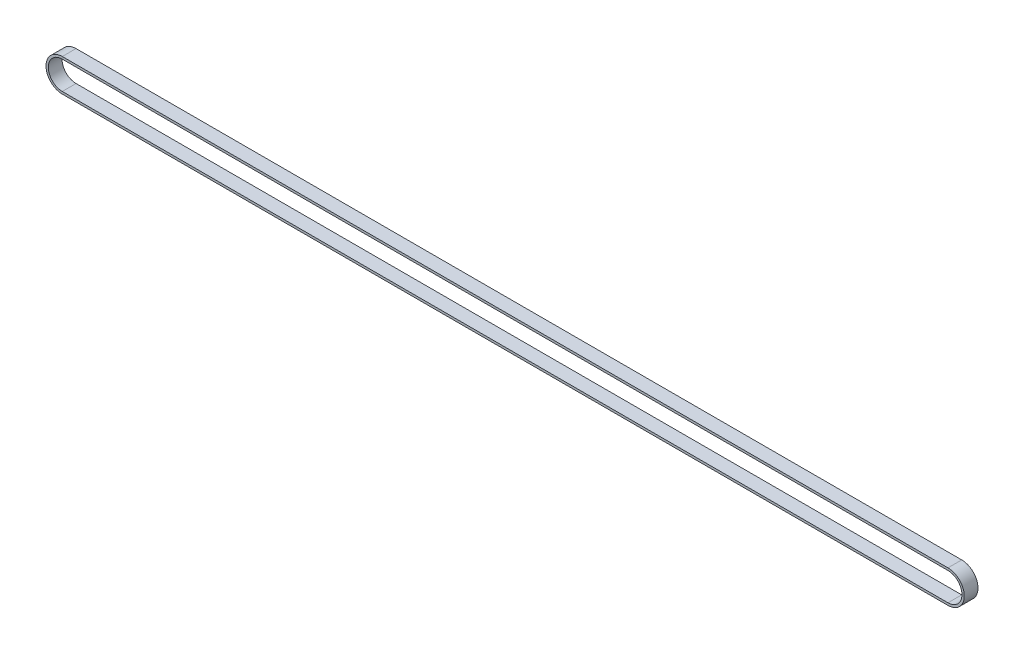
ISO-10303-21;
HEADER;
FILE_DESCRIPTION(('STEP AP214'),'2;1');
FILE_NAME('part.step','',(''),(''),'','','');
FILE_SCHEMA(('AUTOMOTIVE_DESIGN { 1 0 10303 214 1 1 1 1 }'));
ENDSEC;
DATA;
#1=APPLICATION_CONTEXT('core data for automotive mechanical design processes');
#2=APPLICATION_PROTOCOL_DEFINITION('international standard','automotive_design',2000,#1);
#3=PRODUCT_CONTEXT('',#1,'mechanical');
#4=PRODUCT('Part','Part','',(#3));
#5=PRODUCT_RELATED_PRODUCT_CATEGORY('part','',(#4));
#6=PRODUCT_DEFINITION_FORMATION('','',#4);
#7=PRODUCT_DEFINITION_CONTEXT('part definition',#1,'design');
#8=PRODUCT_DEFINITION('design','',#6,#7);
#9=PRODUCT_DEFINITION_SHAPE('','',#8);
#10=(LENGTH_UNIT() NAMED_UNIT(*) SI_UNIT(.MILLI.,.METRE.));
#11=(NAMED_UNIT(*) PLANE_ANGLE_UNIT() SI_UNIT($,.RADIAN.));
#12=(NAMED_UNIT(*) SI_UNIT($,.STERADIAN.) SOLID_ANGLE_UNIT());
#13=UNCERTAINTY_MEASURE_WITH_UNIT(LENGTH_MEASURE(1.E-05),#10,'distance_accuracy_value','');
#14=(GEOMETRIC_REPRESENTATION_CONTEXT(3) GLOBAL_UNCERTAINTY_ASSIGNED_CONTEXT((#13)) GLOBAL_UNIT_ASSIGNED_CONTEXT((#10,
#11,#12)) REPRESENTATION_CONTEXT('',''));
#15=CARTESIAN_POINT('',(0.,0.,0.));
#16=DIRECTION('',(0.,0.,1.));
#17=DIRECTION('',(1.,0.,0.));
#18=AXIS2_PLACEMENT_3D('',#15,#16,#17);
#19=CARTESIAN_POINT('',(0.,6.1,6.));
#20=DIRECTION('',(0.,1.,0.));
#21=DIRECTION('',(0.,0.,1.));
#22=AXIS2_PLACEMENT_3D('',#19,#20,#21);
#23=PLANE('',#22);
#24=DIRECTION('',(1.,0.,0.));
#25=VECTOR('',#24,1.);
#26=CARTESIAN_POINT('',(0.,6.1,0.));
#27=LINE('',#26,#25);
#28=CARTESIAN_POINT('',(0.,6.1,0.));
#29=VERTEX_POINT('',#28);
#30=CARTESIAN_POINT('',(386.26,6.1,0.));
#31=VERTEX_POINT('',#30);
#32=EDGE_CURVE('E115',#29,#31,#27,.T.);
#33=ORIENTED_EDGE('',*,*,#32,.T.);
#34=DIRECTION('',(0.,0.,-1.));
#35=VECTOR('',#34,1.);
#36=CARTESIAN_POINT('',(386.26,6.1,6.));
#37=LINE('',#36,#35);
#38=CARTESIAN_POINT('',(386.26,6.1,6.));
#39=VERTEX_POINT('',#38);
#40=EDGE_CURVE('E113',#39,#31,#37,.T.);
#41=ORIENTED_EDGE('',*,*,#40,.F.);
#42=DIRECTION('',(1.,0.,0.));
#43=VECTOR('',#42,1.);
#44=CARTESIAN_POINT('',(0.,6.1,6.));
#45=LINE('',#44,#43);
#46=CARTESIAN_POINT('',(0.,6.1,6.));
#47=VERTEX_POINT('',#46);
#48=EDGE_CURVE('E104',#47,#39,#45,.T.);
#49=ORIENTED_EDGE('',*,*,#48,.F.);
#50=DIRECTION('',(0.,0.,-1.));
#51=VECTOR('',#50,1.);
#52=CARTESIAN_POINT('',(0.,6.1,6.));
#53=LINE('',#52,#51);
#54=EDGE_CURVE('E150',#47,#29,#53,.T.);
#55=ORIENTED_EDGE('',*,*,#54,.T.);
#56=EDGE_LOOP('',(#33,#41,#49,#55));
#57=FACE_BOUND('',#56,.T.);
#58=ADVANCED_FACE('F34',(#57),#23,.F.);
#59=CARTESIAN_POINT('',(0.,7.1,6.));
#60=DIRECTION('',(0.,1.,0.));
#61=DIRECTION('',(0.,0.,1.));
#62=AXIS2_PLACEMENT_3D('',#59,#60,#61);
#63=PLANE('',#62);
#64=DIRECTION('',(1.,0.,0.));
#65=VECTOR('',#64,1.);
#66=CARTESIAN_POINT('',(0.,7.1,0.));
#67=LINE('',#66,#65);
#68=CARTESIAN_POINT('',(0.,7.1,0.));
#69=VERTEX_POINT('',#68);
#70=CARTESIAN_POINT('',(386.26,7.1,0.));
#71=VERTEX_POINT('',#70);
#72=EDGE_CURVE('E152',#69,#71,#67,.T.);
#73=ORIENTED_EDGE('',*,*,#72,.F.);
#74=DIRECTION('',(0.,0.,-1.));
#75=VECTOR('',#74,1.);
#76=CARTESIAN_POINT('',(0.,7.1,6.));
#77=LINE('',#76,#75);
#78=CARTESIAN_POINT('',(0.,7.1,6.));
#79=VERTEX_POINT('',#78);
#80=EDGE_CURVE('E11',#79,#69,#77,.T.);
#81=ORIENTED_EDGE('',*,*,#80,.F.);
#82=DIRECTION('',(1.,0.,0.));
#83=VECTOR('',#82,1.);
#84=CARTESIAN_POINT('',(0.,7.1,6.));
#85=LINE('',#84,#83);
#86=CARTESIAN_POINT('',(386.26,7.1,6.));
#87=VERTEX_POINT('',#86);
#88=EDGE_CURVE('E110',#79,#87,#85,.T.);
#89=ORIENTED_EDGE('',*,*,#88,.T.);
#90=DIRECTION('',(0.,0.,-1.));
#91=VECTOR('',#90,1.);
#92=CARTESIAN_POINT('',(386.26,7.1,6.));
#93=LINE('',#92,#91);
#94=EDGE_CURVE('E127',#87,#71,#93,.T.);
#95=ORIENTED_EDGE('',*,*,#94,.T.);
#96=EDGE_LOOP('',(#73,#81,#89,#95));
#97=FACE_BOUND('',#96,.T.);
#98=ADVANCED_FACE('F179',(#97),#63,.T.);
#99=CARTESIAN_POINT('',(0.,0.,6.));
#100=DIRECTION('',(0.,0.,-1.));
#101=DIRECTION('',(-1.,0.,0.));
#102=AXIS2_PLACEMENT_3D('',#99,#100,#101);
#103=CYLINDRICAL_SURFACE('',#102,7.1);
#104=CARTESIAN_POINT('',(0.,0.,0.));
#105=DIRECTION('',(0.,0.,1.));
#106=DIRECTION('',(1.,0.,0.));
#107=AXIS2_PLACEMENT_3D('',#104,#105,#106);
#108=CIRCLE('',#107,7.1);
#109=CARTESIAN_POINT('',(0.,-7.1,0.));
#110=VERTEX_POINT('',#109);
#111=EDGE_CURVE('E154',#110,#69,#108,.F.);
#112=ORIENTED_EDGE('',*,*,#111,.F.);
#113=DIRECTION('',(0.,0.,-1.));
#114=VECTOR('',#113,1.);
#115=CARTESIAN_POINT('',(0.,-7.1,6.));
#116=LINE('',#115,#114);
#117=CARTESIAN_POINT('',(0.,-7.1,6.));
#118=VERTEX_POINT('',#117);
#119=EDGE_CURVE('E42',#118,#110,#116,.T.);
#120=ORIENTED_EDGE('',*,*,#119,.F.);
#121=CARTESIAN_POINT('',(0.,0.,6.));
#122=DIRECTION('',(0.,0.,1.));
#123=DIRECTION('',(1.,0.,0.));
#124=AXIS2_PLACEMENT_3D('',#121,#122,#123);
#125=CIRCLE('',#124,7.1);
#126=EDGE_CURVE('E141',#118,#79,#125,.F.);
#127=ORIENTED_EDGE('',*,*,#126,.T.);
#128=ORIENTED_EDGE('',*,*,#80,.T.);
#129=EDGE_LOOP('',(#112,#120,#127,#128));
#130=FACE_BOUND('',#129,.T.);
#131=ADVANCED_FACE('F170',(#130),#103,.T.);
#132=CARTESIAN_POINT('',(193.13,-7.09999999999998,6.));
#133=DIRECTION('',(0.,-1.,0.));
#134=DIRECTION('',(1.,0.,0.));
#135=AXIS2_PLACEMENT_3D('',#132,#133,#134);
#136=PLANE('',#135);
#137=DIRECTION('',(-1.,0.,0.));
#138=VECTOR('',#137,1.);
#139=CARTESIAN_POINT('',(193.13,-7.09999999999998,0.));
#140=LINE('',#139,#138);
#141=CARTESIAN_POINT('',(386.26,-7.1,0.));
#142=VERTEX_POINT('',#141);
#143=EDGE_CURVE('E157',#142,#110,#140,.T.);
#144=ORIENTED_EDGE('',*,*,#143,.F.);
#145=DIRECTION('',(0.,0.,-1.));
#146=VECTOR('',#145,1.);
#147=CARTESIAN_POINT('',(386.26,-7.1,6.));
#148=LINE('',#147,#146);
#149=CARTESIAN_POINT('',(386.26,-7.1,6.));
#150=VERTEX_POINT('',#149);
#151=EDGE_CURVE('E136',#150,#142,#148,.T.);
#152=ORIENTED_EDGE('',*,*,#151,.F.);
#153=DIRECTION('',(-1.,0.,0.));
#154=VECTOR('',#153,1.);
#155=CARTESIAN_POINT('',(193.13,-7.09999999999998,6.));
#156=LINE('',#155,#154);
#157=EDGE_CURVE('E144',#150,#118,#156,.T.);
#158=ORIENTED_EDGE('',*,*,#157,.T.);
#159=ORIENTED_EDGE('',*,*,#119,.T.);
#160=EDGE_LOOP('',(#144,#152,#158,#159));
#161=FACE_BOUND('',#160,.T.);
#162=ADVANCED_FACE('F166',(#161),#136,.T.);
#163=CARTESIAN_POINT('',(193.13,-6.09999999999998,6.));
#164=DIRECTION('',(0.,-1.,0.));
#165=DIRECTION('',(1.,0.,0.));
#166=AXIS2_PLACEMENT_3D('',#163,#164,#165);
#167=PLANE('',#166);
#168=DIRECTION('',(-1.,0.,0.));
#169=VECTOR('',#168,1.);
#170=CARTESIAN_POINT('',(193.13,-6.09999999999998,0.));
#171=LINE('',#170,#169);
#172=CARTESIAN_POINT('',(386.26,-6.1,0.));
#173=VERTEX_POINT('',#172);
#174=CARTESIAN_POINT('',(0.,-6.1,0.));
#175=VERTEX_POINT('',#174);
#176=EDGE_CURVE('E67',#173,#175,#171,.T.);
#177=ORIENTED_EDGE('',*,*,#176,.T.);
#178=DIRECTION('',(0.,0.,-1.));
#179=VECTOR('',#178,1.);
#180=CARTESIAN_POINT('',(0.,-6.1,6.));
#181=LINE('',#180,#179);
#182=CARTESIAN_POINT('',(0.,-6.1,6.));
#183=VERTEX_POINT('',#182);
#184=EDGE_CURVE('E163',#183,#175,#181,.T.);
#185=ORIENTED_EDGE('',*,*,#184,.F.);
#186=DIRECTION('',(-1.,0.,0.));
#187=VECTOR('',#186,1.);
#188=CARTESIAN_POINT('',(193.13,-6.09999999999998,6.));
#189=LINE('',#188,#187);
#190=CARTESIAN_POINT('',(386.26,-6.1,6.));
#191=VERTEX_POINT('',#190);
#192=EDGE_CURVE('E147',#191,#183,#189,.T.);
#193=ORIENTED_EDGE('',*,*,#192,.F.);
#194=DIRECTION('',(0.,0.,-1.));
#195=VECTOR('',#194,1.);
#196=CARTESIAN_POINT('',(386.26,-6.1,6.));
#197=LINE('',#196,#195);
#198=EDGE_CURVE('E119',#191,#173,#197,.T.);
#199=ORIENTED_EDGE('',*,*,#198,.T.);
#200=EDGE_LOOP('',(#177,#185,#193,#199));
#201=FACE_BOUND('',#200,.T.);
#202=ADVANCED_FACE('F189',(#201),#167,.F.);
#203=CARTESIAN_POINT('',(0.,0.,6.));
#204=DIRECTION('',(0.,0.,-1.));
#205=DIRECTION('',(-1.,0.,0.));
#206=AXIS2_PLACEMENT_3D('',#203,#204,#205);
#207=CYLINDRICAL_SURFACE('',#206,6.1);
#208=CARTESIAN_POINT('',(0.,0.,0.));
#209=DIRECTION('',(0.,0.,-1.));
#210=DIRECTION('',(-1.,0.,0.));
#211=AXIS2_PLACEMENT_3D('',#208,#209,#210);
#212=CIRCLE('',#211,6.1);
#213=EDGE_CURVE('E73',#175,#29,#212,.T.);
#214=ORIENTED_EDGE('',*,*,#213,.T.);
#215=ORIENTED_EDGE('',*,*,#54,.F.);
#216=CARTESIAN_POINT('',(0.,0.,6.));
#217=DIRECTION('',(0.,0.,-1.));
#218=DIRECTION('',(-1.,0.,0.));
#219=AXIS2_PLACEMENT_3D('',#216,#217,#218);
#220=CIRCLE('',#219,6.1);
#221=EDGE_CURVE('E50',#183,#47,#220,.T.);
#222=ORIENTED_EDGE('',*,*,#221,.F.);
#223=ORIENTED_EDGE('',*,*,#184,.T.);
#224=EDGE_LOOP('',(#214,#215,#222,#223));
#225=FACE_BOUND('',#224,.T.);
#226=ADVANCED_FACE('F182',(#225),#207,.F.);
#227=CARTESIAN_POINT('',(0.,0.,6.));
#228=DIRECTION('',(0.,0.,1.));
#229=DIRECTION('',(1.,0.,0.));
#230=AXIS2_PLACEMENT_3D('',#227,#228,#229);
#231=PLANE('',#230);
#232=ORIENTED_EDGE('',*,*,#157,.F.);
#233=CARTESIAN_POINT('',(386.26,0.,6.));
#234=DIRECTION('',(0.,0.,-1.));
#235=DIRECTION('',(-1.,0.,0.));
#236=AXIS2_PLACEMENT_3D('',#233,#234,#235);
#237=CIRCLE('',#236,7.1);
#238=EDGE_CURVE('E123',#150,#87,#237,.F.);
#239=ORIENTED_EDGE('',*,*,#238,.T.);
#240=ORIENTED_EDGE('',*,*,#88,.F.);
#241=ORIENTED_EDGE('',*,*,#126,.F.);
#242=EDGE_LOOP('',(#232,#239,#240,#241));
#243=FACE_BOUND('',#242,.T.);
#244=ORIENTED_EDGE('',*,*,#48,.T.);
#245=CARTESIAN_POINT('',(386.26,0.,6.));
#246=DIRECTION('',(0.,0.,1.));
#247=DIRECTION('',(1.,0.,0.));
#248=AXIS2_PLACEMENT_3D('',#245,#246,#247);
#249=CIRCLE('',#248,6.1);
#250=EDGE_CURVE('E108',#191,#39,#249,.T.);
#251=ORIENTED_EDGE('',*,*,#250,.F.);
#252=ORIENTED_EDGE('',*,*,#192,.T.);
#253=ORIENTED_EDGE('',*,*,#221,.T.);
#254=EDGE_LOOP('',(#244,#251,#252,#253));
#255=FACE_BOUND('',#254,.T.);
#256=ADVANCED_FACE('F106',(#243,#255),#231,.T.);
#257=CARTESIAN_POINT('',(0.,0.,0.));
#258=DIRECTION('',(0.,0.,1.));
#259=DIRECTION('',(1.,0.,0.));
#260=AXIS2_PLACEMENT_3D('',#257,#258,#259);
#261=PLANE('',#260);
#262=CARTESIAN_POINT('',(386.26,0.,0.));
#263=DIRECTION('',(0.,0.,-1.));
#264=DIRECTION('',(-1.,0.,0.));
#265=AXIS2_PLACEMENT_3D('',#262,#263,#264);
#266=CIRCLE('',#265,7.1);
#267=EDGE_CURVE('E124',#142,#71,#266,.F.);
#268=ORIENTED_EDGE('',*,*,#267,.F.);
#269=ORIENTED_EDGE('',*,*,#143,.T.);
#270=ORIENTED_EDGE('',*,*,#111,.T.);
#271=ORIENTED_EDGE('',*,*,#72,.T.);
#272=EDGE_LOOP('',(#268,#269,#270,#271));
#273=FACE_BOUND('',#272,.T.);
#274=ORIENTED_EDGE('',*,*,#32,.F.);
#275=ORIENTED_EDGE('',*,*,#213,.F.);
#276=ORIENTED_EDGE('',*,*,#176,.F.);
#277=CARTESIAN_POINT('',(386.26,0.,0.));
#278=DIRECTION('',(0.,0.,1.));
#279=DIRECTION('',(1.,0.,0.));
#280=AXIS2_PLACEMENT_3D('',#277,#278,#279);
#281=CIRCLE('',#280,6.1);
#282=EDGE_CURVE('E130',#173,#31,#281,.T.);
#283=ORIENTED_EDGE('',*,*,#282,.T.);
#284=EDGE_LOOP('',(#274,#275,#276,#283));
#285=FACE_BOUND('',#284,.T.);
#286=ADVANCED_FACE('F173',(#273,#285),#261,.F.);
#287=CARTESIAN_POINT('',(386.26,0.,6.));
#288=DIRECTION('',(0.,0.,-1.));
#289=DIRECTION('',(-1.,0.,0.));
#290=AXIS2_PLACEMENT_3D('',#287,#288,#289);
#291=CYLINDRICAL_SURFACE('',#290,6.1);
#292=ORIENTED_EDGE('',*,*,#282,.F.);
#293=ORIENTED_EDGE('',*,*,#198,.F.);
#294=ORIENTED_EDGE('',*,*,#250,.T.);
#295=ORIENTED_EDGE('',*,*,#40,.T.);
#296=EDGE_LOOP('',(#292,#293,#294,#295));
#297=FACE_BOUND('',#296,.T.);
#298=ADVANCED_FACE('F122',(#297),#291,.F.);
#299=CARTESIAN_POINT('',(386.26,0.,6.));
#300=DIRECTION('',(0.,0.,-1.));
#301=DIRECTION('',(-1.,0.,0.));
#302=AXIS2_PLACEMENT_3D('',#299,#300,#301);
#303=CYLINDRICAL_SURFACE('',#302,7.1);
#304=ORIENTED_EDGE('',*,*,#267,.T.);
#305=ORIENTED_EDGE('',*,*,#94,.F.);
#306=ORIENTED_EDGE('',*,*,#238,.F.);
#307=ORIENTED_EDGE('',*,*,#151,.T.);
#308=EDGE_LOOP('',(#304,#305,#306,#307));
#309=FACE_BOUND('',#308,.T.);
#310=ADVANCED_FACE('F177',(#309),#303,.T.);
#311=CLOSED_SHELL('',(#58,#98,#131,#162,#202,#226,#256,#286,#298,#310));
#312=MANIFOLD_SOLID_BREP('B2',#311);
#313=ADVANCED_BREP_SHAPE_REPRESENTATION('',(#18,#312),#14);
#314=SHAPE_DEFINITION_REPRESENTATION(#9,#313);
ENDSEC;
END-ISO-10303-21;
